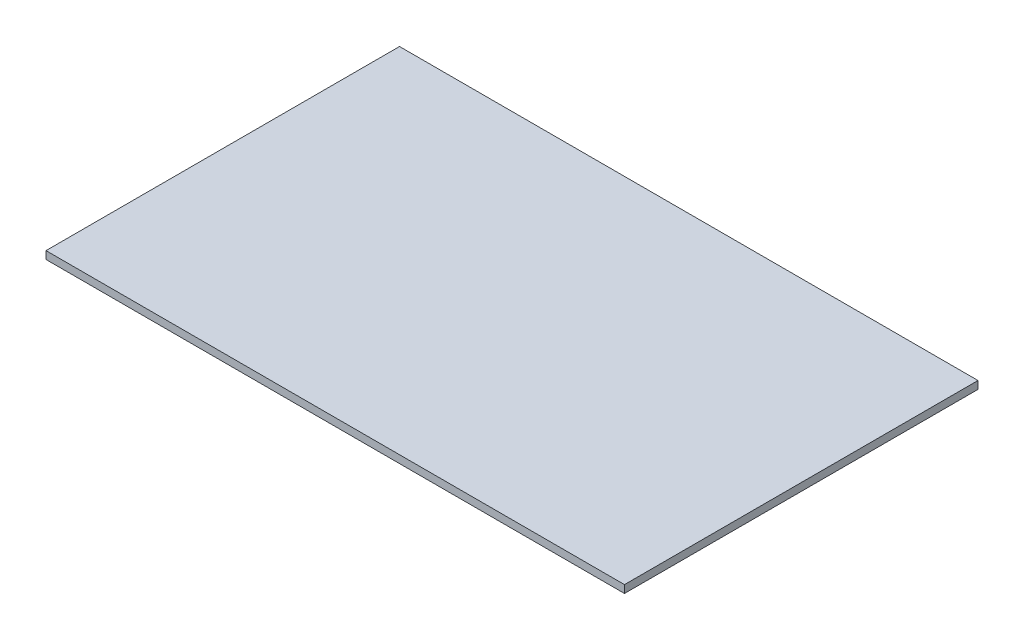
ISO-10303-21;
HEADER;
FILE_DESCRIPTION(('STEP AP214'),'2;1');
FILE_NAME('part.step','',(''),(''),'','','');
FILE_SCHEMA(('AUTOMOTIVE_DESIGN { 1 0 10303 214 1 1 1 1 }'));
ENDSEC;
DATA;
#1=APPLICATION_CONTEXT('core data for automotive mechanical design processes');
#2=APPLICATION_PROTOCOL_DEFINITION('international standard','automotive_design',2000,#1);
#3=PRODUCT_CONTEXT('',#1,'mechanical');
#4=PRODUCT('Part','Part','',(#3));
#5=PRODUCT_RELATED_PRODUCT_CATEGORY('part','',(#4));
#6=PRODUCT_DEFINITION_FORMATION('','',#4);
#7=PRODUCT_DEFINITION_CONTEXT('part definition',#1,'design');
#8=PRODUCT_DEFINITION('design','',#6,#7);
#9=PRODUCT_DEFINITION_SHAPE('','',#8);
#10=(LENGTH_UNIT() NAMED_UNIT(*) SI_UNIT(.MILLI.,.METRE.));
#11=(NAMED_UNIT(*) PLANE_ANGLE_UNIT() SI_UNIT($,.RADIAN.));
#12=(NAMED_UNIT(*) SI_UNIT($,.STERADIAN.) SOLID_ANGLE_UNIT());
#13=UNCERTAINTY_MEASURE_WITH_UNIT(LENGTH_MEASURE(1.E-05),#10,'distance_accuracy_value','');
#14=(GEOMETRIC_REPRESENTATION_CONTEXT(3) GLOBAL_UNCERTAINTY_ASSIGNED_CONTEXT((#13)) GLOBAL_UNIT_ASSIGNED_CONTEXT((#10,
#11,#12)) REPRESENTATION_CONTEXT('',''));
#15=CARTESIAN_POINT('',(0.,0.,0.));
#16=DIRECTION('',(0.,0.,1.));
#17=DIRECTION('',(1.,0.,0.));
#18=AXIS2_PLACEMENT_3D('',#15,#16,#17);
#19=CARTESIAN_POINT('',(0.,6.,0.));
#20=DIRECTION('',(1.,0.,0.));
#21=DIRECTION('',(0.,0.,-1.));
#22=AXIS2_PLACEMENT_3D('',#19,#20,#21);
#23=PLANE('',#22);
#24=DIRECTION('',(0.,0.,1.));
#25=VECTOR('',#24,1.);
#26=CARTESIAN_POINT('',(0.,0.,0.));
#27=LINE('',#26,#25);
#28=CARTESIAN_POINT('',(0.,0.,-275.));
#29=VERTEX_POINT('',#28);
#30=CARTESIAN_POINT('',(0.,0.,0.));
#31=VERTEX_POINT('',#30);
#32=EDGE_CURVE('E102',#29,#31,#27,.T.);
#33=ORIENTED_EDGE('',*,*,#32,.T.);
#34=DIRECTION('',(0.,-1.,0.));
#35=VECTOR('',#34,1.);
#36=CARTESIAN_POINT('',(0.,6.,0.));
#37=LINE('',#36,#35);
#38=CARTESIAN_POINT('',(0.,6.,0.));
#39=VERTEX_POINT('',#38);
#40=EDGE_CURVE('E11',#39,#31,#37,.T.);
#41=ORIENTED_EDGE('',*,*,#40,.F.);
#42=DIRECTION('',(0.,0.,1.));
#43=VECTOR('',#42,1.);
#44=CARTESIAN_POINT('',(0.,6.,0.));
#45=LINE('',#44,#43);
#46=CARTESIAN_POINT('',(0.,6.,-275.));
#47=VERTEX_POINT('',#46);
#48=EDGE_CURVE('E90',#47,#39,#45,.T.);
#49=ORIENTED_EDGE('',*,*,#48,.F.);
#50=DIRECTION('',(0.,-1.,0.));
#51=VECTOR('',#50,1.);
#52=CARTESIAN_POINT('',(0.,6.,-275.));
#53=LINE('',#52,#51);
#54=EDGE_CURVE('E98',#47,#29,#53,.T.);
#55=ORIENTED_EDGE('',*,*,#54,.T.);
#56=EDGE_LOOP('',(#33,#41,#49,#55));
#57=FACE_BOUND('',#56,.T.);
#58=ADVANCED_FACE('F39',(#57),#23,.F.);
#59=CARTESIAN_POINT('',(0.,6.,0.));
#60=DIRECTION('',(0.,0.,-1.));
#61=DIRECTION('',(-1.,0.,0.));
#62=AXIS2_PLACEMENT_3D('',#59,#60,#61);
#63=PLANE('',#62);
#64=DIRECTION('',(1.,0.,0.));
#65=VECTOR('',#64,1.);
#66=CARTESIAN_POINT('',(0.,0.,0.));
#67=LINE('',#66,#65);
#68=CARTESIAN_POINT('',(450.,0.,0.));
#69=VERTEX_POINT('',#68);
#70=EDGE_CURVE('E94',#31,#69,#67,.T.);
#71=ORIENTED_EDGE('',*,*,#70,.T.);
#72=DIRECTION('',(0.,-1.,0.));
#73=VECTOR('',#72,1.);
#74=CARTESIAN_POINT('',(450.,6.,0.));
#75=LINE('',#74,#73);
#76=CARTESIAN_POINT('',(450.,6.,0.));
#77=VERTEX_POINT('',#76);
#78=EDGE_CURVE('E47',#77,#69,#75,.T.);
#79=ORIENTED_EDGE('',*,*,#78,.F.);
#80=DIRECTION('',(1.,0.,0.));
#81=VECTOR('',#80,1.);
#82=CARTESIAN_POINT('',(0.,6.,0.));
#83=LINE('',#82,#81);
#84=EDGE_CURVE('E85',#39,#77,#83,.T.);
#85=ORIENTED_EDGE('',*,*,#84,.F.);
#86=ORIENTED_EDGE('',*,*,#40,.T.);
#87=EDGE_LOOP('',(#71,#79,#85,#86));
#88=FACE_BOUND('',#87,.T.);
#89=ADVANCED_FACE('F93',(#88),#63,.F.);
#90=CARTESIAN_POINT('',(450.,6.,0.));
#91=DIRECTION('',(-1.,0.,0.));
#92=DIRECTION('',(0.,0.,1.));
#93=AXIS2_PLACEMENT_3D('',#90,#91,#92);
#94=PLANE('',#93);
#95=DIRECTION('',(0.,0.,-1.));
#96=VECTOR('',#95,1.);
#97=CARTESIAN_POINT('',(450.,0.,0.));
#98=LINE('',#97,#96);
#99=CARTESIAN_POINT('',(450.,0.,-275.));
#100=VERTEX_POINT('',#99);
#101=EDGE_CURVE('E72',#69,#100,#98,.T.);
#102=ORIENTED_EDGE('',*,*,#101,.T.);
#103=DIRECTION('',(0.,-1.,0.));
#104=VECTOR('',#103,1.);
#105=CARTESIAN_POINT('',(450.,6.,-275.));
#106=LINE('',#105,#104);
#107=CARTESIAN_POINT('',(450.,6.,-275.));
#108=VERTEX_POINT('',#107);
#109=EDGE_CURVE('E95',#108,#100,#106,.T.);
#110=ORIENTED_EDGE('',*,*,#109,.F.);
#111=DIRECTION('',(0.,0.,-1.));
#112=VECTOR('',#111,1.);
#113=CARTESIAN_POINT('',(450.,6.,0.));
#114=LINE('',#113,#112);
#115=EDGE_CURVE('E88',#77,#108,#114,.T.);
#116=ORIENTED_EDGE('',*,*,#115,.F.);
#117=ORIENTED_EDGE('',*,*,#78,.T.);
#118=EDGE_LOOP('',(#102,#110,#116,#117));
#119=FACE_BOUND('',#118,.T.);
#120=ADVANCED_FACE('F96',(#119),#94,.F.);
#121=CARTESIAN_POINT('',(0.,6.,-275.));
#122=DIRECTION('',(0.,0.,1.));
#123=DIRECTION('',(1.,0.,0.));
#124=AXIS2_PLACEMENT_3D('',#121,#122,#123);
#125=PLANE('',#124);
#126=DIRECTION('',(-1.,0.,0.));
#127=VECTOR('',#126,1.);
#128=CARTESIAN_POINT('',(0.,0.,-275.));
#129=LINE('',#128,#127);
#130=EDGE_CURVE('E78',#100,#29,#129,.T.);
#131=ORIENTED_EDGE('',*,*,#130,.T.);
#132=ORIENTED_EDGE('',*,*,#54,.F.);
#133=DIRECTION('',(-1.,0.,0.));
#134=VECTOR('',#133,1.);
#135=CARTESIAN_POINT('',(0.,6.,-275.));
#136=LINE('',#135,#134);
#137=EDGE_CURVE('E55',#108,#47,#136,.T.);
#138=ORIENTED_EDGE('',*,*,#137,.F.);
#139=ORIENTED_EDGE('',*,*,#109,.T.);
#140=EDGE_LOOP('',(#131,#132,#138,#139));
#141=FACE_BOUND('',#140,.T.);
#142=ADVANCED_FACE('F109',(#141),#125,.F.);
#143=CARTESIAN_POINT('',(0.,6.,0.));
#144=DIRECTION('',(0.,-1.,0.));
#145=DIRECTION('',(0.,0.,-1.));
#146=AXIS2_PLACEMENT_3D('',#143,#144,#145);
#147=PLANE('',#146);
#148=ORIENTED_EDGE('',*,*,#48,.T.);
#149=ORIENTED_EDGE('',*,*,#84,.T.);
#150=ORIENTED_EDGE('',*,*,#115,.T.);
#151=ORIENTED_EDGE('',*,*,#137,.T.);
#152=EDGE_LOOP('',(#148,#149,#150,#151));
#153=FACE_BOUND('',#152,.T.);
#154=ADVANCED_FACE('F86',(#153),#147,.F.);
#155=CARTESIAN_POINT('',(0.,0.,0.));
#156=DIRECTION('',(0.,-1.,0.));
#157=DIRECTION('',(0.,0.,-1.));
#158=AXIS2_PLACEMENT_3D('',#155,#156,#157);
#159=PLANE('',#158);
#160=ORIENTED_EDGE('',*,*,#32,.F.);
#161=ORIENTED_EDGE('',*,*,#130,.F.);
#162=ORIENTED_EDGE('',*,*,#101,.F.);
#163=ORIENTED_EDGE('',*,*,#70,.F.);
#164=EDGE_LOOP('',(#160,#161,#162,#163));
#165=FACE_BOUND('',#164,.T.);
#166=ADVANCED_FACE('F112',(#165),#159,.T.);
#167=CLOSED_SHELL('',(#58,#89,#120,#142,#154,#166));
#168=MANIFOLD_SOLID_BREP('B2',#167);
#169=ADVANCED_BREP_SHAPE_REPRESENTATION('',(#18,#168),#14);
#170=SHAPE_DEFINITION_REPRESENTATION(#9,#169);
ENDSEC;
END-ISO-10303-21;
